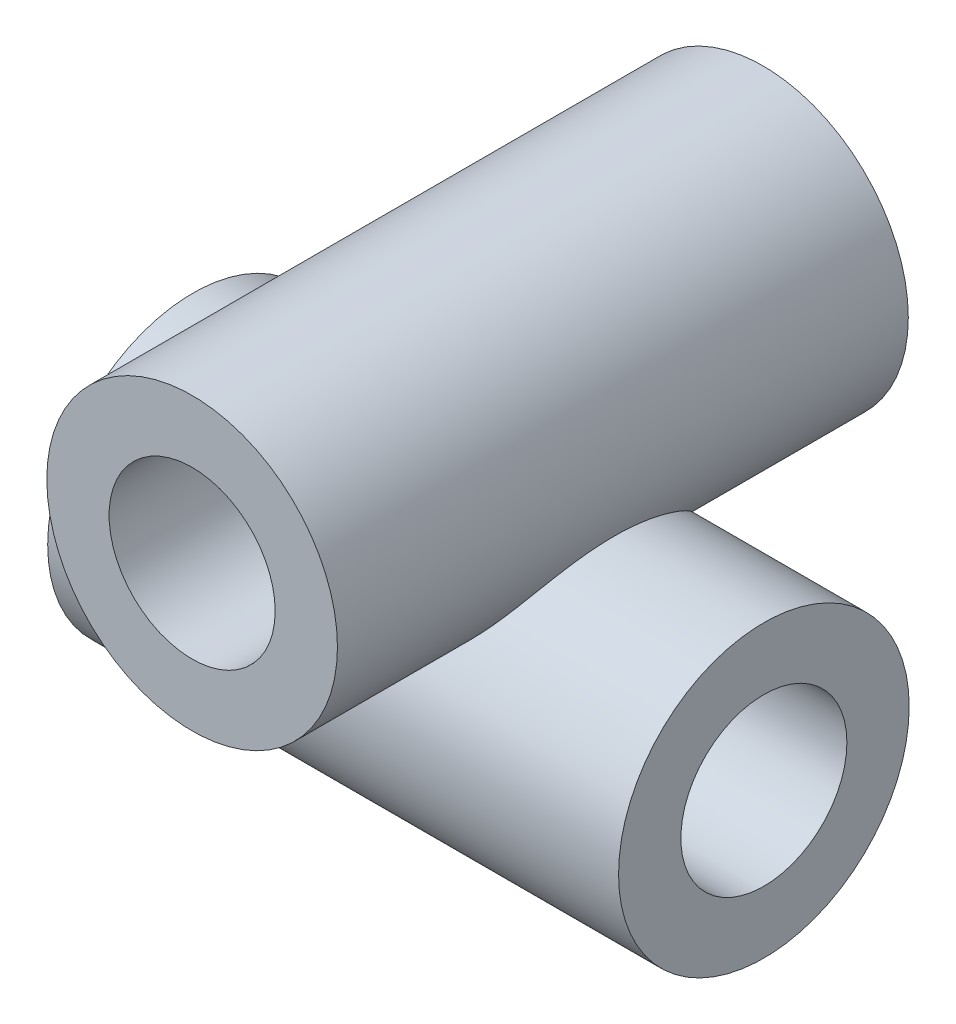
ISO-10303-21;
HEADER;
FILE_DESCRIPTION(('STEP AP214'),'2;1');
FILE_NAME('part.step','',(''),(''),'','','');
FILE_SCHEMA(('AUTOMOTIVE_DESIGN { 1 0 10303 214 1 1 1 1 }'));
ENDSEC;
DATA;
#1=APPLICATION_CONTEXT('core data for automotive mechanical design processes');
#2=APPLICATION_PROTOCOL_DEFINITION('international standard','automotive_design',2000,#1);
#3=PRODUCT_CONTEXT('',#1,'mechanical');
#4=PRODUCT('Part','Part','',(#3));
#5=PRODUCT_RELATED_PRODUCT_CATEGORY('part','',(#4));
#6=PRODUCT_DEFINITION_FORMATION('','',#4);
#7=PRODUCT_DEFINITION_CONTEXT('part definition',#1,'design');
#8=PRODUCT_DEFINITION('design','',#6,#7);
#9=PRODUCT_DEFINITION_SHAPE('','',#8);
#10=(LENGTH_UNIT() NAMED_UNIT(*) SI_UNIT(.MILLI.,.METRE.));
#11=(NAMED_UNIT(*) PLANE_ANGLE_UNIT() SI_UNIT($,.RADIAN.));
#12=(NAMED_UNIT(*) SI_UNIT($,.STERADIAN.) SOLID_ANGLE_UNIT());
#13=UNCERTAINTY_MEASURE_WITH_UNIT(LENGTH_MEASURE(1.E-05),#10,'distance_accuracy_value','');
#14=(GEOMETRIC_REPRESENTATION_CONTEXT(3) GLOBAL_UNCERTAINTY_ASSIGNED_CONTEXT((#13)) GLOBAL_UNIT_ASSIGNED_CONTEXT((#10,
#11,#12)) REPRESENTATION_CONTEXT('',''));
#15=CARTESIAN_POINT('',(0.,0.,0.));
#16=DIRECTION('',(0.,0.,1.));
#17=DIRECTION('',(1.,0.,0.));
#18=AXIS2_PLACEMENT_3D('',#15,#16,#17);
#19=CARTESIAN_POINT('',(0.,0.,110.));
#20=DIRECTION('',(0.,0.,-1.));
#21=DIRECTION('',(-1.,0.,0.));
#22=AXIS2_PLACEMENT_3D('',#19,#20,#21);
#23=CYLINDRICAL_SURFACE('',#22,28.);
#24=CARTESIAN_POINT('',(0.,0.,110.));
#25=DIRECTION('',(0.,0.,1.));
#26=DIRECTION('',(1.,0.,0.));
#27=AXIS2_PLACEMENT_3D('',#24,#25,#26);
#28=CIRCLE('',#27,28.);
#29=CARTESIAN_POINT('',(28.,0.,110.));
#30=VERTEX_POINT('',#29);
#31=EDGE_CURVE('E43',#30,#30,#28,.T.);
#32=ORIENTED_EDGE('',*,*,#31,.F.);
#33=EDGE_LOOP('',(#32));
#34=FACE_BOUND('',#33,.T.);
#35=CARTESIAN_POINT('',(0.,0.,0.));
#36=DIRECTION('',(0.,0.,1.));
#37=DIRECTION('',(1.,0.,0.));
#38=AXIS2_PLACEMENT_3D('',#35,#36,#37);
#39=CIRCLE('',#38,28.);
#40=CARTESIAN_POINT('',(28.,0.,0.));
#41=VERTEX_POINT('',#40);
#42=EDGE_CURVE('E47',#41,#41,#39,.T.);
#43=ORIENTED_EDGE('',*,*,#42,.T.);
#44=EDGE_LOOP('',(#43));
#45=FACE_BOUND('',#44,.T.);
#46=CARTESIAN_POINT('',(0.,-28.,80.984667347189));
#47=CARTESIAN_POINT('',(-0.709976885836483,-27.9999984381259,80.9846688425137));
#48=CARTESIAN_POINT('',(-1.41998183568938,-27.9729742140714,80.974382299833));
#49=CARTESIAN_POINT('',(-2.83530719546801,-27.8651177596588,80.9327577562606));
#50=CARTESIAN_POINT('',(-3.54062732116545,-27.7842822941506,80.9014184896712));
#51=CARTESIAN_POINT('',(-4.94202781984828,-27.5695302381335,80.8162433596027));
#52=CARTESIAN_POINT('',(-5.63810500751963,-27.4355958153276,80.7623999381921));
#53=CARTESIAN_POINT('',(-7.0158843078022,-27.1159995271492,80.6298868265256));
#54=CARTESIAN_POINT('',(-7.69758665534608,-26.930338507867,80.5512175423427));
#55=CARTESIAN_POINT('',(-9.04351225614709,-26.5087446696491,80.365647037206));
#56=CARTESIAN_POINT('',(-9.70768068275535,-26.2726712965789,80.2586666787043));
#57=CARTESIAN_POINT('',(-11.0113205595334,-25.7535046874517,80.0127313229302));
#58=CARTESIAN_POINT('',(-11.6507917227451,-25.4704109052659,79.8737759542697));
#59=CARTESIAN_POINT('',(-12.8993262251224,-24.861405165573,79.5596899735555));
#60=CARTESIAN_POINT('',(-13.5084073963288,-24.5355187352839,79.3845808930131));
#61=CARTESIAN_POINT('',(-14.6912238323088,-23.8460975935534,78.9937224876924));
#62=CARTESIAN_POINT('',(-15.2649617893303,-23.4825657553982,78.7779762635165));
#63=CARTESIAN_POINT('',(-16.344145503955,-22.7436764670392,78.3137168794249));
#64=CARTESIAN_POINT('',(-16.8515755503644,-22.3698372914414,78.0674018922935));
#65=CARTESIAN_POINT('',(-17.8261652888708,-21.6012246731877,77.5314832571014));
#66=CARTESIAN_POINT('',(-18.2933265093112,-21.2064520259499,77.2418812530767));
#67=CARTESIAN_POINT('',(-19.1840229994171,-20.404222973058,76.6176606572929));
#68=CARTESIAN_POINT('',(-19.6075872638468,-19.9967752350801,76.2830723303428));
#69=CARTESIAN_POINT('',(-20.4094758106507,-19.1776381360441,75.5680537043321));
#70=CARTESIAN_POINT('',(-20.7878035637734,-18.7659491030331,75.1876269267059));
#71=CARTESIAN_POINT('',(-21.4643214609533,-17.9867462707627,74.4205350409645));
#72=CARTESIAN_POINT('',(-21.7667211277595,-17.618799993769,74.0380070624158));
#73=CARTESIAN_POINT('',(-22.3346052027225,-16.8931257119261,73.237565864021));
#74=CARTESIAN_POINT('',(-22.6000922318087,-16.5353969830291,72.8196551598685));
#75=CARTESIAN_POINT('',(-23.095559436879,-15.8360011738096,71.9505139092507));
#76=CARTESIAN_POINT('',(-23.3255312977476,-15.4943378678454,71.4992755962856));
#77=CARTESIAN_POINT('',(-23.7519302638262,-14.8324261033276,70.566288774933));
#78=CARTESIAN_POINT('',(-23.9483560693368,-14.5121784747898,70.0845390854114));
#79=CARTESIAN_POINT('',(-24.3117655120013,-13.8948748078847,69.0892171792721));
#80=CARTESIAN_POINT('',(-24.478470106555,-13.5980518122444,68.5753988804931));
#81=CARTESIAN_POINT('',(-24.7830738132666,-13.0346403283078,67.5232774574579));
#82=CARTESIAN_POINT('',(-24.9209730371738,-12.76805172272,66.9849744281993));
#83=CARTESIAN_POINT('',(-25.1708552897019,-12.268096840831,65.8871797219787));
#84=CARTESIAN_POINT('',(-25.2828312238934,-12.0347396656878,65.3276822933754));
#85=CARTESIAN_POINT('',(-25.4835321693592,-11.6037109566939,64.1910516908649));
#86=CARTESIAN_POINT('',(-25.5722558687385,-11.4060414365424,63.6139175239404));
#87=CARTESIAN_POINT('',(-25.7366260584061,-11.0305141536826,62.3875729331124));
#88=CARTESIAN_POINT('',(-25.8101120241989,-10.856547996343,61.7368783633666));
#89=CARTESIAN_POINT('',(-25.9346203207608,-10.5556605435343,60.4225895698978));
#90=CARTESIAN_POINT('',(-25.9856413930649,-10.4287418836904,59.7589946256801));
#91=CARTESIAN_POINT('',(-26.0672373257567,-10.2230816984669,58.4229052630585));
#92=CARTESIAN_POINT('',(-26.0978050163927,-10.1443570678987,57.7504078081114));
#93=CARTESIAN_POINT('',(-26.1397287660719,-10.0358328302353,56.4008810572138));
#94=CARTESIAN_POINT('',(-26.1510842711621,-10.0060346338571,55.723851631156));
#95=CARTESIAN_POINT('',(-26.1552134988389,-9.99524600557183,54.3205325540214));
#96=CARTESIAN_POINT('',(-26.1465898271697,-10.0179258847931,53.5942074123567));
#97=CARTESIAN_POINT('',(-26.1074050165719,-10.1196018400561,52.1460713159552));
#98=CARTESIAN_POINT('',(-26.0768426912085,-10.1986009618216,51.424260607487));
#99=CARTESIAN_POINT('',(-25.9923045704661,-10.4121705774214,49.9900523749439));
#100=CARTESIAN_POINT('',(-25.9383217180105,-10.5467578204893,49.2776577548503));
#101=CARTESIAN_POINT('',(-25.8044913168915,-10.870088334781,47.8677287422922));
#102=CARTESIAN_POINT('',(-25.7246441626729,-11.0588307801031,47.1701941233774));
#103=CARTESIAN_POINT('',(-25.5353962646344,-11.4890794544685,45.7928291206938));
#104=CARTESIAN_POINT('',(-25.4258889565018,-11.7307753266249,45.1130724595049));
#105=CARTESIAN_POINT('',(-25.1733260828958,-12.2633789074592,43.7794964297233));
#106=CARTESIAN_POINT('',(-25.0302699473098,-12.5542874524101,43.1256775021246));
#107=CARTESIAN_POINT('',(-24.7061154040043,-13.1807464966522,41.8501692346065));
#108=CARTESIAN_POINT('',(-24.5250445323886,-13.5162646186848,41.2284570420184));
#109=CARTESIAN_POINT('',(-24.1200714915482,-14.2263503840095,40.0223886338842));
#110=CARTESIAN_POINT('',(-23.8961738452374,-14.6009139018382,39.4380284822949));
#111=CARTESIAN_POINT('',(-23.4191905727623,-15.3533418950786,38.3530284243633));
#112=CARTESIAN_POINT('',(-23.1694146657741,-15.7289826071127,37.849390660539));
#113=CARTESIAN_POINT('',(-22.6264386530195,-16.5005041850347,36.8826231692411));
#114=CARTESIAN_POINT('',(-22.3332409328603,-16.8963839382018,36.4194912185879));
#115=CARTESIAN_POINT('',(-21.7018044114343,-17.7000722646121,35.5370014525265));
#116=CARTESIAN_POINT('',(-21.3635967760817,-18.1078724327715,35.117613702841));
#117=CARTESIAN_POINT('',(-20.6414231320502,-18.9269531056332,34.3241035028142));
#118=CARTESIAN_POINT('',(-20.2574603939361,-19.3382333596299,33.9499778209978));
#119=CARTESIAN_POINT('',(-19.483975929758,-20.1158073335202,33.281501545286));
#120=CARTESIAN_POINT('',(-19.0985878612223,-20.482602941555,32.9829345798196));
#121=CARTESIAN_POINT('',(-18.2926889936425,-21.205433893717,32.4225321856325));
#122=CARTESIAN_POINT('',(-17.8721807438804,-21.5614700162967,32.1606940945497));
#123=CARTESIAN_POINT('',(-16.9981503811355,-22.2570193148065,31.6722736248352));
#124=CARTESIAN_POINT('',(-16.5446201267706,-22.5965283814272,31.4456999839433));
#125=CARTESIAN_POINT('',(-15.6073908715784,-23.2537517569303,31.0258059467168));
#126=CARTESIAN_POINT('',(-15.1236906486383,-23.5714651818277,30.8324868986391));
#127=CARTESIAN_POINT('',(-14.1233517127056,-24.1842733360341,30.4744846596588));
#128=CARTESIAN_POINT('',(-13.606390279199,-24.4790549676851,30.3101684479866));
#129=CARTESIAN_POINT('',(-12.5482093878485,-25.0379816586756,30.0101794292685));
#130=CARTESIAN_POINT('',(-12.0069899811069,-25.3021267825501,29.8745065618856));
#131=CARTESIAN_POINT('',(-10.9036069024846,-25.796841411303,29.6289078927178));
#132=CARTESIAN_POINT('',(-10.3414375593412,-26.0274017404512,29.5189891222592));
#133=CARTESIAN_POINT('',(-9.19972000244512,-26.4525292918458,29.3222403234229));
#134=CARTESIAN_POINT('',(-8.6201708150817,-26.6470944932686,29.2354115912369));
#135=CARTESIAN_POINT('',(-7.38869839317003,-27.0159263150997,29.0748257792933));
#136=CARTESIAN_POINT('',(-6.73530964000984,-27.1862497079339,29.0032275535088));
#137=CARTESIAN_POINT('',(-5.41595216513478,-27.4795241963479,28.8823867602797));
#138=CARTESIAN_POINT('',(-4.74998273379768,-27.602472611288,28.8331454578389));
#139=CARTESIAN_POINT('',(-3.40948079075567,-27.7999023836183,28.7550527167812));
#140=CARTESIAN_POINT('',(-2.73494534664036,-27.8743666610372,28.7262084633204));
#141=CARTESIAN_POINT('',(-1.38170238094711,-27.974117754299,28.6877368254518));
#142=CARTESIAN_POINT('',(-0.702994743023,-27.9994031924385,28.6781099794031));
#143=CARTESIAN_POINT('',(0.702444851428929,-28.0006172251421,28.6776421388831));
#144=CARTESIAN_POINT('',(1.42918348305218,-27.9729341781602,28.6881757961624));
#145=CARTESIAN_POINT('',(2.87769021143442,-27.86120268258,28.7313053961137));
#146=CARTESIAN_POINT('',(3.59945803987882,-27.7771512150413,28.7639025204464));
#147=CARTESIAN_POINT('',(5.03309707628125,-27.5534821826111,28.8527296970519));
#148=CARTESIAN_POINT('',(5.74496532632873,-27.4138483643097,28.9089666623649));
#149=CARTESIAN_POINT('',(7.15333862947438,-27.0804977191668,29.0476153899746));
#150=CARTESIAN_POINT('',(7.8498439375773,-26.8867817907476,29.1300267174609));
#151=CARTESIAN_POINT('',(9.22352409660856,-26.447073366051,29.3246513560815));
#152=CARTESIAN_POINT('',(9.90065630463831,-26.2009743118044,29.4369255323286));
#153=CARTESIAN_POINT('',(11.2285124794813,-25.6599765712134,29.695370427747));
#154=CARTESIAN_POINT('',(11.8792360323015,-25.3650771202214,29.8415416780621));
#155=CARTESIAN_POINT('',(13.1480753592906,-24.7311670990912,30.1722853010226));
#156=CARTESIAN_POINT('',(13.7662151912565,-24.3921897330951,30.3568288296803));
#157=CARTESIAN_POINT('',(14.9647031238778,-23.675828041825,30.7690893931262));
#158=CARTESIAN_POINT('',(15.5450552807281,-23.2984478499594,30.9968017837954));
#159=CARTESIAN_POINT('',(16.6210364876805,-22.5419830103742,31.480985194442));
#160=CARTESIAN_POINT('',(17.1197564281276,-22.1651158857606,31.734054179273));
#161=CARTESIAN_POINT('',(18.0765856945976,-21.3919444052643,32.2836066978402));
#162=CARTESIAN_POINT('',(18.5346972991561,-20.9956411418849,32.5800877932424));
#163=CARTESIAN_POINT('',(19.4071725263123,-20.1919117618148,33.2179690719029));
#164=CARTESIAN_POINT('',(19.8215648446528,-19.7844931646755,33.5593394567017));
#165=CARTESIAN_POINT('',(20.6052176020023,-18.9669617898868,34.2875901135512));
#166=CARTESIAN_POINT('',(20.9744811209861,-18.5568491981139,34.6744672762901));
#167=CARTESIAN_POINT('',(21.6343390541934,-17.7817117745733,35.4536232425368));
#168=CARTESIAN_POINT('',(21.929079688092,-17.4161259015717,35.8418470250586));
#169=CARTESIAN_POINT('',(22.4820211578104,-16.6962490036892,36.6531491235156));
#170=CARTESIAN_POINT('',(22.7402246192381,-16.3419571686232,37.0762249314792));
#171=CARTESIAN_POINT('',(23.2216303989772,-15.6503525845425,37.9550764453767));
#172=CARTESIAN_POINT('',(23.4448238753149,-15.3130441393395,38.4108603697085));
#173=CARTESIAN_POINT('',(23.8582529534624,-14.6605929868522,39.3522525148363));
#174=CARTESIAN_POINT('',(24.0484871760782,-14.3454512074691,39.8378619825438));
#175=CARTESIAN_POINT('',(24.4011248483334,-13.737196875416,40.8431833438884));
#176=CARTESIAN_POINT('',(24.5630725646571,-13.4444814171042,41.3632948618062));
#177=CARTESIAN_POINT('',(24.8584858239743,-12.8900883811088,42.4275489930848));
#178=CARTESIAN_POINT('',(24.9919513716939,-12.6284107982749,42.9716916024581));
#179=CARTESIAN_POINT('',(25.2333028926104,-12.1389837782726,44.0806779381127));
#180=CARTESIAN_POINT('',(25.3411818357441,-11.9112436719903,44.6455273045875));
#181=CARTESIAN_POINT('',(25.5340101618256,-11.492064624323,45.7923478506819));
#182=CARTESIAN_POINT('',(25.6189582654199,-11.3006277085367,46.374319983604));
#183=CARTESIAN_POINT('',(25.7757783418845,-10.9385588964511,47.6108968854966));
#184=CARTESIAN_POINT('',(25.8454945131698,-10.7719193309279,48.26694707721));
#185=CARTESIAN_POINT('',(25.9626764261116,-10.486336099191,49.5913044047435));
#186=CARTESIAN_POINT('',(26.0101408968017,-10.3673951574701,50.2596122384273));
#187=CARTESIAN_POINT('',(26.0847320503578,-10.178266495883,51.6044507539167));
#188=CARTESIAN_POINT('',(26.1118515441907,-10.1080960100257,52.2809842565866));
#189=CARTESIAN_POINT('',(26.1468628637206,-10.017180843507,53.6378599608627));
#190=CARTESIAN_POINT('',(26.1547541666347,-9.99643750668897,54.3182022655198));
#191=CARTESIAN_POINT('',(26.1515444077961,-10.0048410040642,55.7256538497235));
#192=CARTESIAN_POINT('',(26.1390914492149,-10.0375391411801,56.452741875117));
#193=CARTESIAN_POINT('',(26.091991288264,-10.1593417088307,57.9014888978533));
#194=CARTESIAN_POINT('',(26.0573429090451,-10.2484491303045,58.623147605269));
#195=CARTESIAN_POINT('',(25.9641867296754,-10.4822154525706,60.0560822255845));
#196=CARTESIAN_POINT('',(25.9056721816715,-10.626890063598,60.7673551430753));
#197=CARTESIAN_POINT('',(25.7621517231294,-10.9702387489759,62.1740327868828));
#198=CARTESIAN_POINT('',(25.6771462895783,-11.1689118510374,62.8694377986702));
#199=CARTESIAN_POINT('',(25.477089230705,-11.6180183572905,64.2392897682335));
#200=CARTESIAN_POINT('',(25.362023778424,-11.8684755699675,64.9137269210775));
#201=CARTESIAN_POINT('',(25.0976485013044,-12.4177648438296,66.2357250547601));
#202=CARTESIAN_POINT('',(24.9483381862648,-12.7165975974723,66.8832856507154));
#203=CARTESIAN_POINT('',(24.6109615755607,-13.3578306286778,68.1453273097953));
#204=CARTESIAN_POINT('',(24.4229253715985,-13.7001970001655,68.7598335927571));
#205=CARTESIAN_POINT('',(24.0033455163941,-14.4226813743613,69.9506263530436));
#206=CARTESIAN_POINT('',(23.7718066275344,-14.8027952425807,70.5269170046253));
#207=CARTESIAN_POINT('',(23.2804192856283,-15.5631286936547,71.5938151480715));
#208=CARTESIAN_POINT('',(23.0240638551025,-15.941140942027,72.0876057785425));
#209=CARTESIAN_POINT('',(22.4679597386105,-16.7157999653771,73.0344851396524));
#210=CARTESIAN_POINT('',(22.1682135403421,-17.1124456711737,73.4875762012844));
#211=CARTESIAN_POINT('',(21.5239373570138,-17.9160562978865,74.350046142841));
#212=CARTESIAN_POINT('',(21.1794360307723,-18.323014482139,74.7594526930476));
#213=CARTESIAN_POINT('',(20.4451829463782,-19.1388473927572,75.5332793933626));
#214=CARTESIAN_POINT('',(20.0554341410528,-19.5477219923893,75.8977024758702));
#215=CARTESIAN_POINT('',(19.2706591431489,-20.3203271558074,76.5490077767074));
#216=CARTESIAN_POINT('',(18.8796063142696,-20.6846748803314,76.8399625671695));
#217=CARTESIAN_POINT('',(18.0629145544727,-21.4015479470594,77.3855258870605));
#218=CARTESIAN_POINT('',(17.637278074838,-21.7540741246747,77.640136989003));
#219=CARTESIAN_POINT('',(16.7536073069708,-22.4417062473455,78.1146181182515));
#220=CARTESIAN_POINT('',(16.2955639552752,-22.7768072731573,78.3344783704925));
#221=CARTESIAN_POINT('',(15.3499941140137,-23.4244768484679,78.7415326171303));
#222=CARTESIAN_POINT('',(14.8624663999175,-23.7370444609365,78.9287252535354));
#223=CARTESIAN_POINT('',(13.8521206807165,-24.3407320889631,79.2760663782897));
#224=CARTESIAN_POINT('',(13.3288275032331,-24.6313686188931,79.4356713937456));
#225=CARTESIAN_POINT('',(12.2584314928989,-25.1812018534866,79.7265581463493));
#226=CARTESIAN_POINT('',(11.711328469483,-25.4403983064528,79.8578396567565));
#227=CARTESIAN_POINT('',(10.5967155290843,-25.9244843759832,80.0949751111583));
#228=CARTESIAN_POINT('',(10.0292018646139,-26.1493676523434,80.2008243579875));
#229=CARTESIAN_POINT('',(8.87731993503589,-26.5625231640858,80.389750372688));
#230=CARTESIAN_POINT('',(8.29295114866302,-26.7507942657945,80.4728264354342));
#231=CARTESIAN_POINT('',(7.07982469997787,-27.0978713993792,80.6223806531655));
#232=CARTESIAN_POINT('',(6.45034367334495,-27.2546221496646,80.6877638696094));
#233=CARTESIAN_POINT('',(5.18031384533783,-27.5242771244691,80.7981844326152));
#234=CARTESIAN_POINT('',(4.53976480923494,-27.6371804178829,80.8432213471246));
#235=CARTESIAN_POINT('',(3.25118146497633,-27.8182174816707,80.914616834419));
#236=CARTESIAN_POINT('',(2.60314532282902,-27.8863400356655,80.9409707277358));
#237=CARTESIAN_POINT('',(1.303414109421,-27.9772330098099,80.9759956869776));
#238=CARTESIAN_POINT('',(0.65171887837268,-28.0000014337127,80.984665974565));
#239=CARTESIAN_POINT('',(0.,-28.,80.984667347189));
#240=B_SPLINE_CURVE_WITH_KNOTS('',3,(#46,#47,#48,#49,#50,#51,#52,#53,#54,#55,#56,#57,#58,#59,
#60,#61,#62,#63,#64,#65,#66,#67,#68,#69,#70,#71,#72,#73,#74,#75,#76,#77,#78,#79,#80,#81,#82,#83,
#84,#85,#86,#87,#88,#89,#90,#91,#92,#93,#94,#95,#96,#97,#98,#99,#100,#101,#102,#103,#104,#105,
#106,#107,#108,#109,#110,#111,#112,#113,#114,#115,#116,#117,#118,#119,#120,#121,#122,#123,#124,
#125,#126,#127,#128,#129,#130,#131,#132,#133,#134,#135,#136,#137,#138,#139,#140,#141,#142,#143,
#144,#145,#146,#147,#148,#149,#150,#151,#152,#153,#154,#155,#156,#157,#158,#159,#160,#161,#162,
#163,#164,#165,#166,#167,#168,#169,#170,#171,#172,#173,#174,#175,#176,#177,#178,#179,#180,#181,
#182,#183,#184,#185,#186,#187,#188,#189,#190,#191,#192,#193,#194,#195,#196,#197,#198,#199,#200,
#201,#202,#203,#204,#205,#206,#207,#208,#209,#210,#211,#212,#213,#214,#215,#216,#217,#218,#219,
#220,#221,#222,#223,#224,#225,#226,#227,#228,#229,#230,#231,#232,#233,#234,#235,#236,#237,#238,
#239),.UNSPECIFIED.,.T.,.F.,(4,2,2,2,2,2,2,2,2,2,2,2,2,2,2,2,2,2,2,2,2,2,2,2,2,2,2,2,2,2,2,2,2,
2,2,2,2,2,2,2,2,2,2,2,2,2,2,2,2,2,2,2,2,2,2,2,2,2,2,2,2,2,2,2,2,2,2,2,2,2,2,2,2,2,2,2,2,2,2,2,2,
2,2,2,2,2,2,2,2,2,2,2,2,2,2,2,4),(0.,2.12938980774149,4.25890764668024,6.38914125118865,
8.51934001357756,10.6555573660829,12.7917995318887,14.926773099723,17.0615838356185,
19.0888514434232,21.1160420753919,23.1418756641779,25.1675537220274,26.9979446133219,
28.8282054738734,30.6588942032504,32.4896538442717,34.3367877293808,36.1839144484642,
38.0315460749171,39.8792819226267,41.9097204356407,43.9402726776875,45.9715363394355,
48.0028585684532,50.1805001987398,52.3582596040099,54.5366756683023,56.7150585121076,
58.9013742175732,61.0877270789228,63.2725016787141,65.4570456728321,67.4826180677992,
69.5080792184763,71.5321451195887,73.5560664275944,75.384129805355,77.2120606039232,
79.0404436041712,80.868900715972,82.7190524533884,84.5692002934356,86.4198526696625,
88.2706089129443,90.3054299226038,92.3403660525591,94.3760186616452,96.4117282969912,
98.5911981356227,100.770784710096,102.951009108784,105.131197291323,107.315863545232,
109.50056403366,111.683628207168,113.866457659124,115.886817596194,117.90706409893,
119.925976226209,121.944750488643,123.77045836047,125.596034967892,127.422071895447,
129.248185215857,131.101443337605,132.954701151833,134.808467570707,136.662337393239,
138.701514490683,140.740808047086,142.780821862475,144.820891141873,147.002116616583,
149.18345775415,151.365416065958,153.547335092345,155.730259526876,157.913215211005,
160.094481000474,162.275508138563,164.290635505195,166.305647385415,168.319375260567,
170.332971794665,172.156434102417,173.979767276055,175.803612425732,177.627533374537,
179.484070305463,181.340622098142,183.197516520129,185.054468430558,187.008511816161,
188.962596693812,190.917170831219,192.871830996647),.UNSPECIFIED.);
#241=CARTESIAN_POINT('',(0.,-28.,80.984667347189));
#242=VERTEX_POINT('',#241);
#243=EDGE_CURVE('E10',#242,#242,#240,.T.);
#244=ORIENTED_EDGE('',*,*,#243,.F.);
#245=EDGE_LOOP('',(#244));
#246=FACE_BOUND('',#245,.T.);
#247=ADVANCED_FACE('F32',(#34,#45,#246),#23,.T.);
#248=CARTESIAN_POINT('',(0.,0.,110.));
#249=DIRECTION('',(0.,0.,1.));
#250=DIRECTION('',(1.,0.,0.));
#251=AXIS2_PLACEMENT_3D('',#248,#249,#250);
#252=PLANE('',#251);
#253=CARTESIAN_POINT('',(0.,0.,110.));
#254=DIRECTION('',(0.,0.,1.));
#255=DIRECTION('',(1.,0.,0.));
#256=AXIS2_PLACEMENT_3D('',#253,#254,#255);
#257=CIRCLE('',#256,16.);
#258=CARTESIAN_POINT('',(16.,0.,110.));
#259=VERTEX_POINT('',#258);
#260=EDGE_CURVE('E60',#259,#259,#257,.T.);
#261=ORIENTED_EDGE('',*,*,#260,.F.);
#262=EDGE_LOOP('',(#261));
#263=FACE_BOUND('',#262,.T.);
#264=ORIENTED_EDGE('',*,*,#31,.T.);
#265=EDGE_LOOP('',(#264));
#266=FACE_BOUND('',#265,.T.);
#267=ADVANCED_FACE('F95',(#263,#266),#252,.T.);
#268=CARTESIAN_POINT('',(0.,0.,0.));
#269=DIRECTION('',(0.,0.,1.));
#270=DIRECTION('',(1.,0.,0.));
#271=AXIS2_PLACEMENT_3D('',#268,#269,#270);
#272=PLANE('',#271);
#273=CARTESIAN_POINT('',(0.,0.,0.));
#274=DIRECTION('',(0.,0.,1.));
#275=DIRECTION('',(1.,0.,0.));
#276=AXIS2_PLACEMENT_3D('',#273,#274,#275);
#277=CIRCLE('',#276,16.);
#278=CARTESIAN_POINT('',(16.,0.,0.));
#279=VERTEX_POINT('',#278);
#280=EDGE_CURVE('E57',#279,#279,#277,.T.);
#281=ORIENTED_EDGE('',*,*,#280,.T.);
#282=EDGE_LOOP('',(#281));
#283=FACE_BOUND('',#282,.T.);
#284=ORIENTED_EDGE('',*,*,#42,.F.);
#285=EDGE_LOOP('',(#284));
#286=FACE_BOUND('',#285,.T.);
#287=ADVANCED_FACE('F90',(#283,#286),#272,.F.);
#288=CARTESIAN_POINT('',(55.,-38.,54.831273685945));
#289=DIRECTION('',(-1.,0.,0.));
#290=DIRECTION('',(0.,0.,1.));
#291=AXIS2_PLACEMENT_3D('',#288,#289,#290);
#292=CYLINDRICAL_SURFACE('',#291,28.);
#293=CARTESIAN_POINT('',(-55.,-38.,54.831273685945));
#294=DIRECTION('',(1.,0.,0.));
#295=DIRECTION('',(0.,0.,-1.));
#296=AXIS2_PLACEMENT_3D('',#293,#294,#295);
#297=CIRCLE('',#296,28.);
#298=CARTESIAN_POINT('',(-55.,-38.,26.831273685945));
#299=VERTEX_POINT('',#298);
#300=EDGE_CURVE('E54',#299,#299,#297,.T.);
#301=ORIENTED_EDGE('',*,*,#300,.T.);
#302=EDGE_LOOP('',(#301));
#303=FACE_BOUND('',#302,.T.);
#304=CARTESIAN_POINT('',(55.,-38.,54.831273685945));
#305=DIRECTION('',(1.,0.,0.));
#306=DIRECTION('',(0.,0.,-1.));
#307=AXIS2_PLACEMENT_3D('',#304,#305,#306);
#308=CIRCLE('',#307,28.);
#309=CARTESIAN_POINT('',(55.,-38.,26.831273685945));
#310=VERTEX_POINT('',#309);
#311=EDGE_CURVE('E52',#310,#310,#308,.T.);
#312=ORIENTED_EDGE('',*,*,#311,.F.);
#313=EDGE_LOOP('',(#312));
#314=FACE_BOUND('',#313,.T.);
#315=ORIENTED_EDGE('',*,*,#243,.T.);
#316=EDGE_LOOP('',(#315));
#317=FACE_BOUND('',#316,.T.);
#318=ADVANCED_FACE('F85',(#303,#314,#317),#292,.T.);
#319=CARTESIAN_POINT('',(55.,-38.,54.831273685945));
#320=DIRECTION('',(1.,0.,0.));
#321=DIRECTION('',(0.,0.,-1.));
#322=AXIS2_PLACEMENT_3D('',#319,#320,#321);
#323=PLANE('',#322);
#324=CARTESIAN_POINT('',(55.,-38.,54.831273685945));
#325=DIRECTION('',(1.,0.,0.));
#326=DIRECTION('',(0.,0.,-1.));
#327=AXIS2_PLACEMENT_3D('',#324,#325,#326);
#328=CIRCLE('',#327,16.);
#329=CARTESIAN_POINT('',(55.,-38.,38.831273685945));
#330=VERTEX_POINT('',#329);
#331=EDGE_CURVE('E66',#330,#330,#328,.T.);
#332=ORIENTED_EDGE('',*,*,#331,.F.);
#333=EDGE_LOOP('',(#332));
#334=FACE_BOUND('',#333,.T.);
#335=ORIENTED_EDGE('',*,*,#311,.T.);
#336=EDGE_LOOP('',(#335));
#337=FACE_BOUND('',#336,.T.);
#338=ADVANCED_FACE('F82',(#334,#337),#323,.T.);
#339=CARTESIAN_POINT('',(-55.,-38.,54.831273685945));
#340=DIRECTION('',(1.,0.,0.));
#341=DIRECTION('',(0.,0.,-1.));
#342=AXIS2_PLACEMENT_3D('',#339,#340,#341);
#343=PLANE('',#342);
#344=CARTESIAN_POINT('',(-55.,-38.,54.831273685945));
#345=DIRECTION('',(1.,0.,0.));
#346=DIRECTION('',(0.,0.,-1.));
#347=AXIS2_PLACEMENT_3D('',#344,#345,#346);
#348=CIRCLE('',#347,16.);
#349=CARTESIAN_POINT('',(-55.,-38.,38.831273685945));
#350=VERTEX_POINT('',#349);
#351=EDGE_CURVE('E63',#350,#350,#348,.T.);
#352=ORIENTED_EDGE('',*,*,#351,.T.);
#353=EDGE_LOOP('',(#352));
#354=FACE_BOUND('',#353,.T.);
#355=ORIENTED_EDGE('',*,*,#300,.F.);
#356=EDGE_LOOP('',(#355));
#357=FACE_BOUND('',#356,.T.);
#358=ADVANCED_FACE('F72',(#354,#357),#343,.F.);
#359=CARTESIAN_POINT('',(0.,0.,0.));
#360=DIRECTION('',(0.,0.,1.));
#361=DIRECTION('',(1.,0.,0.));
#362=AXIS2_PLACEMENT_3D('',#359,#360,#361);
#363=CYLINDRICAL_SURFACE('',#362,16.);
#364=ORIENTED_EDGE('',*,*,#280,.F.);
#365=EDGE_LOOP('',(#364));
#366=FACE_BOUND('',#365,.T.);
#367=ORIENTED_EDGE('',*,*,#260,.T.);
#368=EDGE_LOOP('',(#367));
#369=FACE_BOUND('',#368,.T.);
#370=ADVANCED_FACE('F78',(#366,#369),#363,.F.);
#371=CARTESIAN_POINT('',(-55.,-38.,54.831273685945));
#372=DIRECTION('',(1.,0.,0.));
#373=DIRECTION('',(0.,0.,-1.));
#374=AXIS2_PLACEMENT_3D('',#371,#372,#373);
#375=CYLINDRICAL_SURFACE('',#374,16.);
#376=ORIENTED_EDGE('',*,*,#351,.F.);
#377=EDGE_LOOP('',(#376));
#378=FACE_BOUND('',#377,.T.);
#379=ORIENTED_EDGE('',*,*,#331,.T.);
#380=EDGE_LOOP('',(#379));
#381=FACE_BOUND('',#380,.T.);
#382=ADVANCED_FACE('F75',(#378,#381),#375,.F.);
#383=CLOSED_SHELL('',(#247,#267,#287,#318,#338,#358,#370,#382));
#384=MANIFOLD_SOLID_BREP('B2',#383);
#385=ADVANCED_BREP_SHAPE_REPRESENTATION('',(#18,#384),#14);
#386=SHAPE_DEFINITION_REPRESENTATION(#9,#385);
ENDSEC;
END-ISO-10303-21;
